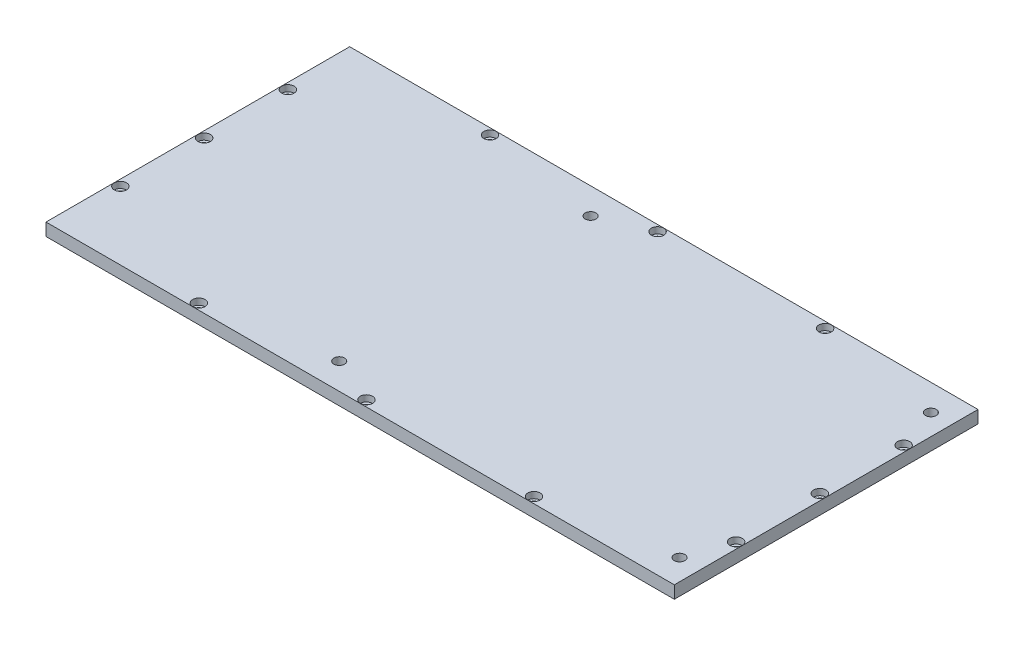
ISO-10303-21;
HEADER;
FILE_DESCRIPTION(('STEP AP214'),'2;1');
FILE_NAME('part.step','',(''),(''),'','','');
FILE_SCHEMA(('AUTOMOTIVE_DESIGN { 1 0 10303 214 1 1 1 1 }'));
ENDSEC;
DATA;
#1=APPLICATION_CONTEXT('core data for automotive mechanical design processes');
#2=APPLICATION_PROTOCOL_DEFINITION('international standard','automotive_design',2000,#1);
#3=PRODUCT_CONTEXT('',#1,'mechanical');
#4=PRODUCT('Part','Part','',(#3));
#5=PRODUCT_RELATED_PRODUCT_CATEGORY('part','',(#4));
#6=PRODUCT_DEFINITION_FORMATION('','',#4);
#7=PRODUCT_DEFINITION_CONTEXT('part definition',#1,'design');
#8=PRODUCT_DEFINITION('design','',#6,#7);
#9=PRODUCT_DEFINITION_SHAPE('','',#8);
#10=(LENGTH_UNIT() NAMED_UNIT(*) SI_UNIT(.MILLI.,.METRE.));
#11=(NAMED_UNIT(*) PLANE_ANGLE_UNIT() SI_UNIT($,.RADIAN.));
#12=(NAMED_UNIT(*) SI_UNIT($,.STERADIAN.) SOLID_ANGLE_UNIT());
#13=UNCERTAINTY_MEASURE_WITH_UNIT(LENGTH_MEASURE(1.E-05),#10,'distance_accuracy_value','');
#14=(GEOMETRIC_REPRESENTATION_CONTEXT(3) GLOBAL_UNCERTAINTY_ASSIGNED_CONTEXT((#13)) GLOBAL_UNIT_ASSIGNED_CONTEXT((#10,
#11,#12)) REPRESENTATION_CONTEXT('',''));
#15=CARTESIAN_POINT('',(0.,0.,0.));
#16=DIRECTION('',(0.,0.,1.));
#17=DIRECTION('',(1.,0.,0.));
#18=AXIS2_PLACEMENT_3D('',#15,#16,#17);
#19=CARTESIAN_POINT('',(147.,6.,0.));
#20=DIRECTION('',(0.,-1.,0.));
#21=DIRECTION('',(0.,0.,-1.));
#22=AXIS2_PLACEMENT_3D('',#19,#20,#21);
#23=CYLINDRICAL_SURFACE('',#22,1.59999999999999);
#24=CARTESIAN_POINT('',(147.,0.,0.));
#25=DIRECTION('',(0.,-1.,0.));
#26=DIRECTION('',(0.,0.,-1.));
#27=AXIS2_PLACEMENT_3D('',#24,#25,#26);
#28=CIRCLE('',#27,1.59999999999999);
#29=CARTESIAN_POINT('',(147.,0.,-1.59999999999999));
#30=VERTEX_POINT('',#29);
#31=EDGE_CURVE('E80',#30,#30,#28,.T.);
#32=ORIENTED_EDGE('',*,*,#31,.T.);
#33=EDGE_LOOP('',(#32));
#34=FACE_BOUND('',#33,.T.);
#35=CARTESIAN_POINT('',(147.,3.,0.));
#36=DIRECTION('',(0.,1.,0.));
#37=DIRECTION('',(0.,0.,1.));
#38=AXIS2_PLACEMENT_3D('',#35,#36,#37);
#39=CIRCLE('',#38,1.59999999999999);
#40=CARTESIAN_POINT('',(147.,3.,1.59999999999999));
#41=VERTEX_POINT('',#40);
#42=EDGE_CURVE('E37',#41,#41,#39,.F.);
#43=ORIENTED_EDGE('',*,*,#42,.F.);
#44=EDGE_LOOP('',(#43));
#45=FACE_BOUND('',#44,.T.);
#46=ADVANCED_FACE('F33',(#34,#45),#23,.F.);
#47=CARTESIAN_POINT('',(-147.,6.,40.));
#48=DIRECTION('',(0.,-1.,0.));
#49=DIRECTION('',(0.,0.,-1.));
#50=AXIS2_PLACEMENT_3D('',#47,#48,#49);
#51=CYLINDRICAL_SURFACE('',#50,1.59999999999999);
#52=CARTESIAN_POINT('',(-147.,0.,40.));
#53=DIRECTION('',(0.,-1.,0.));
#54=DIRECTION('',(0.,0.,1.));
#55=AXIS2_PLACEMENT_3D('',#52,#53,#54);
#56=CIRCLE('',#55,1.59999999999999);
#57=CARTESIAN_POINT('',(-147.,0.,41.6));
#58=VERTEX_POINT('',#57);
#59=EDGE_CURVE('E680',#58,#58,#56,.T.);
#60=ORIENTED_EDGE('',*,*,#59,.T.);
#61=EDGE_LOOP('',(#60));
#62=FACE_BOUND('',#61,.T.);
#63=CARTESIAN_POINT('',(-147.,3.,40.));
#64=DIRECTION('',(0.,1.,0.));
#65=DIRECTION('',(0.,0.,1.));
#66=AXIS2_PLACEMENT_3D('',#63,#64,#65);
#67=CIRCLE('',#66,1.59999999999999);
#68=CARTESIAN_POINT('',(-147.,3.,41.6));
#69=VERTEX_POINT('',#68);
#70=EDGE_CURVE('E127',#69,#69,#67,.F.);
#71=ORIENTED_EDGE('',*,*,#70,.F.);
#72=EDGE_LOOP('',(#71));
#73=FACE_BOUND('',#72,.T.);
#74=ADVANCED_FACE('F196',(#62,#73),#51,.F.);
#75=CARTESIAN_POINT('',(0.,6.,69.5));
#76=DIRECTION('',(0.,-1.,0.));
#77=DIRECTION('',(0.,0.,-1.));
#78=AXIS2_PLACEMENT_3D('',#75,#76,#77);
#79=CYLINDRICAL_SURFACE('',#78,1.6);
#80=CARTESIAN_POINT('',(0.,0.,69.5));
#81=DIRECTION('',(0.,-1.,0.));
#82=DIRECTION('',(0.,0.,-1.));
#83=AXIS2_PLACEMENT_3D('',#80,#81,#82);
#84=CIRCLE('',#83,1.6);
#85=CARTESIAN_POINT('',(0.,0.,67.9));
#86=VERTEX_POINT('',#85);
#87=EDGE_CURVE('E676',#86,#86,#84,.T.);
#88=ORIENTED_EDGE('',*,*,#87,.T.);
#89=EDGE_LOOP('',(#88));
#90=FACE_BOUND('',#89,.T.);
#91=CARTESIAN_POINT('',(0.,3.,69.5));
#92=DIRECTION('',(0.,1.,0.));
#93=DIRECTION('',(0.,0.,1.));
#94=AXIS2_PLACEMENT_3D('',#91,#92,#93);
#95=CIRCLE('',#94,1.6);
#96=CARTESIAN_POINT('',(0.,3.,71.1));
#97=VERTEX_POINT('',#96);
#98=EDGE_CURVE('E125',#97,#97,#95,.F.);
#99=ORIENTED_EDGE('',*,*,#98,.F.);
#100=EDGE_LOOP('',(#99));
#101=FACE_BOUND('',#100,.T.);
#102=ADVANCED_FACE('F202',(#90,#101),#79,.F.);
#103=CARTESIAN_POINT('',(-80.,6.,69.5));
#104=DIRECTION('',(0.,-1.,0.));
#105=DIRECTION('',(0.,0.,-1.));
#106=AXIS2_PLACEMENT_3D('',#103,#104,#105);
#107=CYLINDRICAL_SURFACE('',#106,1.60000000000001);
#108=CARTESIAN_POINT('',(-80.,0.,69.5));
#109=DIRECTION('',(0.,-1.,0.));
#110=DIRECTION('',(0.,0.,-1.));
#111=AXIS2_PLACEMENT_3D('',#108,#109,#110);
#112=CIRCLE('',#111,1.60000000000001);
#113=CARTESIAN_POINT('',(-80.,0.,67.9));
#114=VERTEX_POINT('',#113);
#115=EDGE_CURVE('E672',#114,#114,#112,.T.);
#116=ORIENTED_EDGE('',*,*,#115,.T.);
#117=EDGE_LOOP('',(#116));
#118=FACE_BOUND('',#117,.T.);
#119=CARTESIAN_POINT('',(-80.,3.,69.5));
#120=DIRECTION('',(0.,1.,0.));
#121=DIRECTION('',(0.,0.,1.));
#122=AXIS2_PLACEMENT_3D('',#119,#120,#121);
#123=CIRCLE('',#122,1.60000000000001);
#124=CARTESIAN_POINT('',(-80.,3.,71.1));
#125=VERTEX_POINT('',#124);
#126=EDGE_CURVE('E122',#125,#125,#123,.F.);
#127=ORIENTED_EDGE('',*,*,#126,.F.);
#128=EDGE_LOOP('',(#127));
#129=FACE_BOUND('',#128,.T.);
#130=ADVANCED_FACE('F519',(#118,#129),#107,.F.);
#131=CARTESIAN_POINT('',(80.,6.,69.5));
#132=DIRECTION('',(0.,-1.,0.));
#133=DIRECTION('',(0.,0.,-1.));
#134=AXIS2_PLACEMENT_3D('',#131,#132,#133);
#135=CYLINDRICAL_SURFACE('',#134,1.60000000000001);
#136=CARTESIAN_POINT('',(80.,0.,69.5));
#137=DIRECTION('',(0.,-1.,0.));
#138=DIRECTION('',(0.,0.,1.));
#139=AXIS2_PLACEMENT_3D('',#136,#137,#138);
#140=CIRCLE('',#139,1.60000000000001);
#141=CARTESIAN_POINT('',(80.,0.,71.1));
#142=VERTEX_POINT('',#141);
#143=EDGE_CURVE('E668',#142,#142,#140,.T.);
#144=ORIENTED_EDGE('',*,*,#143,.T.);
#145=EDGE_LOOP('',(#144));
#146=FACE_BOUND('',#145,.T.);
#147=CARTESIAN_POINT('',(80.,3.,69.5));
#148=DIRECTION('',(0.,1.,0.));
#149=DIRECTION('',(0.,0.,1.));
#150=AXIS2_PLACEMENT_3D('',#147,#148,#149);
#151=CIRCLE('',#150,1.60000000000001);
#152=CARTESIAN_POINT('',(80.,3.,71.1));
#153=VERTEX_POINT('',#152);
#154=EDGE_CURVE('E119',#153,#153,#151,.F.);
#155=ORIENTED_EDGE('',*,*,#154,.F.);
#156=EDGE_LOOP('',(#155));
#157=FACE_BOUND('',#156,.T.);
#158=ADVANCED_FACE('F528',(#146,#157),#135,.F.);
#159=CARTESIAN_POINT('',(-147.,6.,0.));
#160=DIRECTION('',(0.,-1.,0.));
#161=DIRECTION('',(0.,0.,-1.));
#162=AXIS2_PLACEMENT_3D('',#159,#160,#161);
#163=CYLINDRICAL_SURFACE('',#162,1.60000000000002);
#164=CARTESIAN_POINT('',(-147.,0.,0.));
#165=DIRECTION('',(0.,-1.,0.));
#166=DIRECTION('',(0.,0.,1.));
#167=AXIS2_PLACEMENT_3D('',#164,#165,#166);
#168=CIRCLE('',#167,1.60000000000002);
#169=CARTESIAN_POINT('',(-147.,0.,1.60000000000002));
#170=VERTEX_POINT('',#169);
#171=EDGE_CURVE('E664',#170,#170,#168,.T.);
#172=ORIENTED_EDGE('',*,*,#171,.T.);
#173=EDGE_LOOP('',(#172));
#174=FACE_BOUND('',#173,.T.);
#175=CARTESIAN_POINT('',(-147.,3.,0.));
#176=DIRECTION('',(0.,1.,0.));
#177=DIRECTION('',(0.,0.,1.));
#178=AXIS2_PLACEMENT_3D('',#175,#176,#177);
#179=CIRCLE('',#178,1.60000000000002);
#180=CARTESIAN_POINT('',(-147.,3.,1.60000000000002));
#181=VERTEX_POINT('',#180);
#182=EDGE_CURVE('E116',#181,#181,#179,.F.);
#183=ORIENTED_EDGE('',*,*,#182,.F.);
#184=EDGE_LOOP('',(#183));
#185=FACE_BOUND('',#184,.T.);
#186=ADVANCED_FACE('F537',(#174,#185),#163,.F.);
#187=CARTESIAN_POINT('',(-147.,6.,-40.));
#188=DIRECTION('',(0.,-1.,0.));
#189=DIRECTION('',(0.,0.,-1.));
#190=AXIS2_PLACEMENT_3D('',#187,#188,#189);
#191=CYLINDRICAL_SURFACE('',#190,1.59999999999999);
#192=CARTESIAN_POINT('',(-147.,0.,-40.));
#193=DIRECTION('',(0.,-1.,0.));
#194=DIRECTION('',(0.,0.,-1.));
#195=AXIS2_PLACEMENT_3D('',#192,#193,#194);
#196=CIRCLE('',#195,1.59999999999999);
#197=CARTESIAN_POINT('',(-147.,0.,-41.6));
#198=VERTEX_POINT('',#197);
#199=EDGE_CURVE('E660',#198,#198,#196,.T.);
#200=ORIENTED_EDGE('',*,*,#199,.T.);
#201=EDGE_LOOP('',(#200));
#202=FACE_BOUND('',#201,.T.);
#203=CARTESIAN_POINT('',(-147.,3.,-40.));
#204=DIRECTION('',(0.,1.,0.));
#205=DIRECTION('',(0.,0.,1.));
#206=AXIS2_PLACEMENT_3D('',#203,#204,#205);
#207=CIRCLE('',#206,1.59999999999999);
#208=CARTESIAN_POINT('',(-147.,3.,-38.4));
#209=VERTEX_POINT('',#208);
#210=EDGE_CURVE('E113',#209,#209,#207,.F.);
#211=ORIENTED_EDGE('',*,*,#210,.F.);
#212=EDGE_LOOP('',(#211));
#213=FACE_BOUND('',#212,.T.);
#214=ADVANCED_FACE('F546',(#202,#213),#191,.F.);
#215=CARTESIAN_POINT('',(147.,6.,-40.));
#216=DIRECTION('',(0.,-1.,0.));
#217=DIRECTION('',(0.,0.,-1.));
#218=AXIS2_PLACEMENT_3D('',#215,#216,#217);
#219=CYLINDRICAL_SURFACE('',#218,1.59999999999999);
#220=CARTESIAN_POINT('',(147.,0.,-40.));
#221=DIRECTION('',(0.,-1.,0.));
#222=DIRECTION('',(0.,0.,1.));
#223=AXIS2_PLACEMENT_3D('',#220,#221,#222);
#224=CIRCLE('',#223,1.59999999999999);
#225=CARTESIAN_POINT('',(147.,0.,-38.4));
#226=VERTEX_POINT('',#225);
#227=EDGE_CURVE('E656',#226,#226,#224,.T.);
#228=ORIENTED_EDGE('',*,*,#227,.T.);
#229=EDGE_LOOP('',(#228));
#230=FACE_BOUND('',#229,.T.);
#231=CARTESIAN_POINT('',(147.,3.,-40.));
#232=DIRECTION('',(0.,1.,0.));
#233=DIRECTION('',(0.,0.,1.));
#234=AXIS2_PLACEMENT_3D('',#231,#232,#233);
#235=CIRCLE('',#234,1.59999999999999);
#236=CARTESIAN_POINT('',(147.,3.,-38.4));
#237=VERTEX_POINT('',#236);
#238=EDGE_CURVE('E110',#237,#237,#235,.F.);
#239=ORIENTED_EDGE('',*,*,#238,.F.);
#240=EDGE_LOOP('',(#239));
#241=FACE_BOUND('',#240,.T.);
#242=ADVANCED_FACE('F555',(#230,#241),#219,.F.);
#243=CARTESIAN_POINT('',(147.,6.,40.));
#244=DIRECTION('',(0.,-1.,0.));
#245=DIRECTION('',(0.,0.,-1.));
#246=AXIS2_PLACEMENT_3D('',#243,#244,#245);
#247=CYLINDRICAL_SURFACE('',#246,1.59999999999999);
#248=CARTESIAN_POINT('',(147.,0.,40.));
#249=DIRECTION('',(0.,-1.,0.));
#250=DIRECTION('',(0.,0.,-1.));
#251=AXIS2_PLACEMENT_3D('',#248,#249,#250);
#252=CIRCLE('',#251,1.59999999999999);
#253=CARTESIAN_POINT('',(147.,0.,38.4));
#254=VERTEX_POINT('',#253);
#255=EDGE_CURVE('E146',#254,#254,#252,.T.);
#256=ORIENTED_EDGE('',*,*,#255,.T.);
#257=EDGE_LOOP('',(#256));
#258=FACE_BOUND('',#257,.T.);
#259=CARTESIAN_POINT('',(147.,3.,40.));
#260=DIRECTION('',(0.,1.,0.));
#261=DIRECTION('',(0.,0.,1.));
#262=AXIS2_PLACEMENT_3D('',#259,#260,#261);
#263=CIRCLE('',#262,1.59999999999999);
#264=CARTESIAN_POINT('',(147.,3.,41.6));
#265=VERTEX_POINT('',#264);
#266=EDGE_CURVE('E107',#265,#265,#263,.F.);
#267=ORIENTED_EDGE('',*,*,#266,.F.);
#268=EDGE_LOOP('',(#267));
#269=FACE_BOUND('',#268,.T.);
#270=ADVANCED_FACE('F564',(#258,#269),#247,.F.);
#271=CARTESIAN_POINT('',(80.,6.,-69.5));
#272=DIRECTION('',(0.,-1.,0.));
#273=DIRECTION('',(0.,0.,-1.));
#274=AXIS2_PLACEMENT_3D('',#271,#272,#273);
#275=CYLINDRICAL_SURFACE('',#274,1.60000000000001);
#276=CARTESIAN_POINT('',(80.,0.,-69.5));
#277=DIRECTION('',(0.,-1.,0.));
#278=DIRECTION('',(0.,0.,-1.));
#279=AXIS2_PLACEMENT_3D('',#276,#277,#278);
#280=CIRCLE('',#279,1.60000000000001);
#281=CARTESIAN_POINT('',(80.,0.,-71.1));
#282=VERTEX_POINT('',#281);
#283=EDGE_CURVE('E141',#282,#282,#280,.T.);
#284=ORIENTED_EDGE('',*,*,#283,.T.);
#285=EDGE_LOOP('',(#284));
#286=FACE_BOUND('',#285,.T.);
#287=CARTESIAN_POINT('',(80.,3.,-69.5));
#288=DIRECTION('',(0.,1.,0.));
#289=DIRECTION('',(0.,0.,1.));
#290=AXIS2_PLACEMENT_3D('',#287,#288,#289);
#291=CIRCLE('',#290,1.60000000000001);
#292=CARTESIAN_POINT('',(80.,3.,-67.9));
#293=VERTEX_POINT('',#292);
#294=EDGE_CURVE('E104',#293,#293,#291,.F.);
#295=ORIENTED_EDGE('',*,*,#294,.F.);
#296=EDGE_LOOP('',(#295));
#297=FACE_BOUND('',#296,.T.);
#298=ADVANCED_FACE('F573',(#286,#297),#275,.F.);
#299=CARTESIAN_POINT('',(0.,6.,-69.5));
#300=DIRECTION('',(0.,-1.,0.));
#301=DIRECTION('',(0.,0.,-1.));
#302=AXIS2_PLACEMENT_3D('',#299,#300,#301);
#303=CYLINDRICAL_SURFACE('',#302,1.6);
#304=CARTESIAN_POINT('',(0.,0.,-69.5));
#305=DIRECTION('',(0.,-1.,0.));
#306=DIRECTION('',(0.,0.,1.));
#307=AXIS2_PLACEMENT_3D('',#304,#305,#306);
#308=CIRCLE('',#307,1.6);
#309=CARTESIAN_POINT('',(0.,0.,-67.9));
#310=VERTEX_POINT('',#309);
#311=EDGE_CURVE('E136',#310,#310,#308,.T.);
#312=ORIENTED_EDGE('',*,*,#311,.T.);
#313=EDGE_LOOP('',(#312));
#314=FACE_BOUND('',#313,.T.);
#315=CARTESIAN_POINT('',(0.,3.,-69.5));
#316=DIRECTION('',(0.,1.,0.));
#317=DIRECTION('',(0.,0.,1.));
#318=AXIS2_PLACEMENT_3D('',#315,#316,#317);
#319=CIRCLE('',#318,1.6);
#320=CARTESIAN_POINT('',(0.,3.,-67.9));
#321=VERTEX_POINT('',#320);
#322=EDGE_CURVE('E100',#321,#321,#319,.F.);
#323=ORIENTED_EDGE('',*,*,#322,.F.);
#324=EDGE_LOOP('',(#323));
#325=FACE_BOUND('',#324,.T.);
#326=ADVANCED_FACE('F582',(#314,#325),#303,.F.);
#327=CARTESIAN_POINT('',(-80.,6.,-69.5));
#328=DIRECTION('',(0.,-1.,0.));
#329=DIRECTION('',(0.,0.,-1.));
#330=AXIS2_PLACEMENT_3D('',#327,#328,#329);
#331=CYLINDRICAL_SURFACE('',#330,1.60000000000001);
#332=CARTESIAN_POINT('',(-80.,0.,-69.5));
#333=DIRECTION('',(0.,-1.,0.));
#334=DIRECTION('',(0.,0.,1.));
#335=AXIS2_PLACEMENT_3D('',#332,#333,#334);
#336=CIRCLE('',#335,1.60000000000001);
#337=CARTESIAN_POINT('',(-80.,0.,-67.9));
#338=VERTEX_POINT('',#337);
#339=EDGE_CURVE('E132',#338,#338,#336,.T.);
#340=ORIENTED_EDGE('',*,*,#339,.T.);
#341=EDGE_LOOP('',(#340));
#342=FACE_BOUND('',#341,.T.);
#343=CARTESIAN_POINT('',(-80.,3.,-69.5));
#344=DIRECTION('',(0.,1.,0.));
#345=DIRECTION('',(0.,0.,1.));
#346=AXIS2_PLACEMENT_3D('',#343,#344,#345);
#347=CIRCLE('',#346,1.60000000000001);
#348=CARTESIAN_POINT('',(-80.,3.,-67.9));
#349=VERTEX_POINT('',#348);
#350=EDGE_CURVE('E97',#349,#349,#347,.F.);
#351=ORIENTED_EDGE('',*,*,#350,.F.);
#352=EDGE_LOOP('',(#351));
#353=FACE_BOUND('',#352,.T.);
#354=ADVANCED_FACE('F194',(#342,#353),#331,.F.);
#355=CARTESIAN_POINT('',(150.,60.,-72.5));
#356=DIRECTION('',(-1.,0.,0.));
#357=DIRECTION('',(0.,0.,1.));
#358=AXIS2_PLACEMENT_3D('',#355,#356,#357);
#359=PLANE('',#358);
#360=DIRECTION('',(0.,0.,-1.));
#361=VECTOR('',#360,1.);
#362=CARTESIAN_POINT('',(150.,6.,72.5));
#363=LINE('',#362,#361);
#364=CARTESIAN_POINT('',(150.,6.,72.5));
#365=VERTEX_POINT('',#364);
#366=CARTESIAN_POINT('',(150.,6.,-72.5));
#367=VERTEX_POINT('',#366);
#368=EDGE_CURVE('E76',#365,#367,#363,.T.);
#369=ORIENTED_EDGE('',*,*,#368,.F.);
#370=DIRECTION('',(0.,-1.,0.));
#371=VECTOR('',#370,1.);
#372=CARTESIAN_POINT('',(150.,60.,72.5));
#373=LINE('',#372,#371);
#374=CARTESIAN_POINT('',(150.,0.,72.5));
#375=VERTEX_POINT('',#374);
#376=EDGE_CURVE('E58',#365,#375,#373,.T.);
#377=ORIENTED_EDGE('',*,*,#376,.T.);
#378=DIRECTION('',(0.,0.,-1.));
#379=VECTOR('',#378,1.);
#380=CARTESIAN_POINT('',(150.,0.,-72.5));
#381=LINE('',#380,#379);
#382=CARTESIAN_POINT('',(150.,0.,-72.5));
#383=VERTEX_POINT('',#382);
#384=EDGE_CURVE('E172',#375,#383,#381,.T.);
#385=ORIENTED_EDGE('',*,*,#384,.T.);
#386=DIRECTION('',(0.,-1.,0.));
#387=VECTOR('',#386,1.);
#388=CARTESIAN_POINT('',(150.,60.,-72.5));
#389=LINE('',#388,#387);
#390=EDGE_CURVE('E11',#367,#383,#389,.T.);
#391=ORIENTED_EDGE('',*,*,#390,.F.);
#392=EDGE_LOOP('',(#369,#377,#385,#391));
#393=FACE_BOUND('',#392,.T.);
#394=ADVANCED_FACE('F35',(#393),#359,.F.);
#395=CARTESIAN_POINT('',(-150.,60.,-72.5));
#396=DIRECTION('',(0.,0.,1.));
#397=DIRECTION('',(1.,0.,0.));
#398=AXIS2_PLACEMENT_3D('',#395,#396,#397);
#399=PLANE('',#398);
#400=DIRECTION('',(-1.,0.,0.));
#401=VECTOR('',#400,1.);
#402=CARTESIAN_POINT('',(150.,6.,-72.5));
#403=LINE('',#402,#401);
#404=CARTESIAN_POINT('',(-150.,6.,-72.5));
#405=VERTEX_POINT('',#404);
#406=EDGE_CURVE('E83',#367,#405,#403,.T.);
#407=ORIENTED_EDGE('',*,*,#406,.F.);
#408=ORIENTED_EDGE('',*,*,#390,.T.);
#409=DIRECTION('',(-1.,0.,0.));
#410=VECTOR('',#409,1.);
#411=CARTESIAN_POINT('',(-150.,0.,-72.5));
#412=LINE('',#411,#410);
#413=CARTESIAN_POINT('',(-150.,0.,-72.5));
#414=VERTEX_POINT('',#413);
#415=EDGE_CURVE('E176',#383,#414,#412,.T.);
#416=ORIENTED_EDGE('',*,*,#415,.T.);
#417=DIRECTION('',(0.,-1.,0.));
#418=VECTOR('',#417,1.);
#419=CARTESIAN_POINT('',(-150.,60.,-72.5));
#420=LINE('',#419,#418);
#421=EDGE_CURVE('E42',#405,#414,#420,.T.);
#422=ORIENTED_EDGE('',*,*,#421,.F.);
#423=EDGE_LOOP('',(#407,#408,#416,#422));
#424=FACE_BOUND('',#423,.T.);
#425=ADVANCED_FACE('F187',(#424),#399,.F.);
#426=CARTESIAN_POINT('',(-150.,60.,-72.5));
#427=DIRECTION('',(1.,0.,0.));
#428=DIRECTION('',(0.,0.,-1.));
#429=AXIS2_PLACEMENT_3D('',#426,#427,#428);
#430=PLANE('',#429);
#431=DIRECTION('',(0.,0.,1.));
#432=VECTOR('',#431,1.);
#433=CARTESIAN_POINT('',(-150.,6.,-72.5));
#434=LINE('',#433,#432);
#435=CARTESIAN_POINT('',(-150.,6.,72.5));
#436=VERTEX_POINT('',#435);
#437=EDGE_CURVE('E50',#405,#436,#434,.T.);
#438=ORIENTED_EDGE('',*,*,#437,.F.);
#439=ORIENTED_EDGE('',*,*,#421,.T.);
#440=DIRECTION('',(0.,0.,1.));
#441=VECTOR('',#440,1.);
#442=CARTESIAN_POINT('',(-150.,0.,-72.5));
#443=LINE('',#442,#441);
#444=CARTESIAN_POINT('',(-150.,0.,72.5));
#445=VERTEX_POINT('',#444);
#446=EDGE_CURVE('E92',#414,#445,#443,.T.);
#447=ORIENTED_EDGE('',*,*,#446,.T.);
#448=DIRECTION('',(0.,-1.,0.));
#449=VECTOR('',#448,1.);
#450=CARTESIAN_POINT('',(-150.,60.,72.5));
#451=LINE('',#450,#449);
#452=EDGE_CURVE('E89',#436,#445,#451,.T.);
#453=ORIENTED_EDGE('',*,*,#452,.F.);
#454=EDGE_LOOP('',(#438,#439,#447,#453));
#455=FACE_BOUND('',#454,.T.);
#456=ADVANCED_FACE('F181',(#455),#430,.F.);
#457=CARTESIAN_POINT('',(-150.,60.,72.5));
#458=DIRECTION('',(0.,0.,-1.));
#459=DIRECTION('',(-1.,0.,0.));
#460=AXIS2_PLACEMENT_3D('',#457,#458,#459);
#461=PLANE('',#460);
#462=DIRECTION('',(1.,0.,0.));
#463=VECTOR('',#462,1.);
#464=CARTESIAN_POINT('',(-150.,6.,72.5));
#465=LINE('',#464,#463);
#466=EDGE_CURVE('E74',#436,#365,#465,.T.);
#467=ORIENTED_EDGE('',*,*,#466,.F.);
#468=ORIENTED_EDGE('',*,*,#452,.T.);
#469=DIRECTION('',(1.,0.,0.));
#470=VECTOR('',#469,1.);
#471=CARTESIAN_POINT('',(-150.,0.,72.5));
#472=LINE('',#471,#470);
#473=EDGE_CURVE('E87',#445,#375,#472,.T.);
#474=ORIENTED_EDGE('',*,*,#473,.T.);
#475=ORIENTED_EDGE('',*,*,#376,.F.);
#476=EDGE_LOOP('',(#467,#468,#474,#475));
#477=FACE_BOUND('',#476,.T.);
#478=ADVANCED_FACE('F85',(#477),#461,.F.);
#479=CARTESIAN_POINT('',(0.,0.,0.));
#480=DIRECTION('',(0.,1.,0.));
#481=DIRECTION('',(0.,0.,1.));
#482=AXIS2_PLACEMENT_3D('',#479,#480,#481);
#483=PLANE('',#482);
#484=ORIENTED_EDGE('',*,*,#339,.F.);
#485=EDGE_LOOP('',(#484));
#486=FACE_BOUND('',#485,.T.);
#487=ORIENTED_EDGE('',*,*,#311,.F.);
#488=EDGE_LOOP('',(#487));
#489=FACE_BOUND('',#488,.T.);
#490=ORIENTED_EDGE('',*,*,#283,.F.);
#491=EDGE_LOOP('',(#490));
#492=FACE_BOUND('',#491,.T.);
#493=ORIENTED_EDGE('',*,*,#255,.F.);
#494=EDGE_LOOP('',(#493));
#495=FACE_BOUND('',#494,.T.);
#496=ORIENTED_EDGE('',*,*,#227,.F.);
#497=EDGE_LOOP('',(#496));
#498=FACE_BOUND('',#497,.T.);
#499=ORIENTED_EDGE('',*,*,#199,.F.);
#500=EDGE_LOOP('',(#499));
#501=FACE_BOUND('',#500,.T.);
#502=ORIENTED_EDGE('',*,*,#171,.F.);
#503=EDGE_LOOP('',(#502));
#504=FACE_BOUND('',#503,.T.);
#505=ORIENTED_EDGE('',*,*,#143,.F.);
#506=EDGE_LOOP('',(#505));
#507=FACE_BOUND('',#506,.T.);
#508=ORIENTED_EDGE('',*,*,#115,.F.);
#509=EDGE_LOOP('',(#508));
#510=FACE_BOUND('',#509,.T.);
#511=ORIENTED_EDGE('',*,*,#87,.F.);
#512=EDGE_LOOP('',(#511));
#513=FACE_BOUND('',#512,.T.);
#514=ORIENTED_EDGE('',*,*,#59,.F.);
#515=EDGE_LOOP('',(#514));
#516=FACE_BOUND('',#515,.T.);
#517=ORIENTED_EDGE('',*,*,#31,.F.);
#518=EDGE_LOOP('',(#517));
#519=FACE_BOUND('',#518,.T.);
#520=CARTESIAN_POINT('',(-22.5000000000001,0.,-60.));
#521=DIRECTION('',(0.,1.,0.));
#522=DIRECTION('',(0.,0.,-1.));
#523=AXIS2_PLACEMENT_3D('',#520,#521,#522);
#524=CIRCLE('',#523,2.54999999999999);
#525=CARTESIAN_POINT('',(-22.5000000000001,0.,-62.55));
#526=VERTEX_POINT('',#525);
#527=EDGE_CURVE('E164',#526,#526,#524,.T.);
#528=ORIENTED_EDGE('',*,*,#527,.T.);
#529=EDGE_LOOP('',(#528));
#530=FACE_BOUND('',#529,.T.);
#531=CARTESIAN_POINT('',(-22.5000000000001,0.,60.));
#532=DIRECTION('',(0.,1.,0.));
#533=DIRECTION('',(0.,0.,1.));
#534=AXIS2_PLACEMENT_3D('',#531,#532,#533);
#535=CIRCLE('',#534,2.54999999999999);
#536=CARTESIAN_POINT('',(-22.5000000000001,0.,62.55));
#537=VERTEX_POINT('',#536);
#538=EDGE_CURVE('E158',#537,#537,#535,.T.);
#539=ORIENTED_EDGE('',*,*,#538,.T.);
#540=EDGE_LOOP('',(#539));
#541=FACE_BOUND('',#540,.T.);
#542=CARTESIAN_POINT('',(140.,0.,60.));
#543=DIRECTION('',(0.,1.,0.));
#544=DIRECTION('',(0.,0.,-1.));
#545=AXIS2_PLACEMENT_3D('',#542,#543,#544);
#546=CIRCLE('',#545,2.54999999999999);
#547=CARTESIAN_POINT('',(140.,0.,57.45));
#548=VERTEX_POINT('',#547);
#549=EDGE_CURVE('E151',#548,#548,#546,.T.);
#550=ORIENTED_EDGE('',*,*,#549,.T.);
#551=EDGE_LOOP('',(#550));
#552=FACE_BOUND('',#551,.T.);
#553=CARTESIAN_POINT('',(140.,0.,-60.));
#554=DIRECTION('',(0.,1.,0.));
#555=DIRECTION('',(0.,0.,1.));
#556=AXIS2_PLACEMENT_3D('',#553,#554,#555);
#557=CIRCLE('',#556,2.54999999999999);
#558=CARTESIAN_POINT('',(140.,0.,-57.45));
#559=VERTEX_POINT('',#558);
#560=EDGE_CURVE('E169',#559,#559,#557,.T.);
#561=ORIENTED_EDGE('',*,*,#560,.T.);
#562=EDGE_LOOP('',(#561));
#563=FACE_BOUND('',#562,.T.);
#564=ORIENTED_EDGE('',*,*,#384,.F.);
#565=ORIENTED_EDGE('',*,*,#473,.F.);
#566=ORIENTED_EDGE('',*,*,#446,.F.);
#567=ORIENTED_EDGE('',*,*,#415,.F.);
#568=EDGE_LOOP('',(#564,#565,#566,#567));
#569=FACE_BOUND('',#568,.T.);
#570=ADVANCED_FACE('F185',(#486,#489,#492,#495,#498,#501,#504,#507,#510,#513,#516,#519,#530,
#541,#552,#563,#569),#483,.F.);
#571=CARTESIAN_POINT('',(0.,6.,0.));
#572=DIRECTION('',(0.,1.,0.));
#573=DIRECTION('',(0.,0.,1.));
#574=AXIS2_PLACEMENT_3D('',#571,#572,#573);
#575=PLANE('',#574);
#576=CARTESIAN_POINT('',(-80.,6.,69.5));
#577=DIRECTION('',(0.,1.,0.));
#578=DIRECTION('',(0.,0.,1.));
#579=AXIS2_PLACEMENT_3D('',#576,#577,#578);
#580=CIRCLE('',#579,2.95);
#581=CARTESIAN_POINT('',(-80.,6.,72.45));
#582=VERTEX_POINT('',#581);
#583=EDGE_CURVE('E717',#582,#582,#580,.T.);
#584=ORIENTED_EDGE('',*,*,#583,.F.);
#585=EDGE_LOOP('',(#584));
#586=FACE_BOUND('',#585,.T.);
#587=CARTESIAN_POINT('',(0.,6.,69.5));
#588=DIRECTION('',(0.,1.,0.));
#589=DIRECTION('',(0.,0.,1.));
#590=AXIS2_PLACEMENT_3D('',#587,#588,#589);
#591=CIRCLE('',#590,2.95);
#592=CARTESIAN_POINT('',(0.,6.,72.45));
#593=VERTEX_POINT('',#592);
#594=EDGE_CURVE('E723',#593,#593,#591,.T.);
#595=ORIENTED_EDGE('',*,*,#594,.F.);
#596=EDGE_LOOP('',(#595));
#597=FACE_BOUND('',#596,.T.);
#598=CARTESIAN_POINT('',(80.,6.,69.5));
#599=DIRECTION('',(0.,1.,0.));
#600=DIRECTION('',(0.,0.,1.));
#601=AXIS2_PLACEMENT_3D('',#598,#599,#600);
#602=CIRCLE('',#601,2.95);
#603=CARTESIAN_POINT('',(80.,6.,72.45));
#604=VERTEX_POINT('',#603);
#605=EDGE_CURVE('E729',#604,#604,#602,.T.);
#606=ORIENTED_EDGE('',*,*,#605,.F.);
#607=EDGE_LOOP('',(#606));
#608=FACE_BOUND('',#607,.T.);
#609=CARTESIAN_POINT('',(-147.,6.,40.));
#610=DIRECTION('',(0.,1.,0.));
#611=DIRECTION('',(0.,0.,1.));
#612=AXIS2_PLACEMENT_3D('',#609,#610,#611);
#613=CIRCLE('',#612,2.95);
#614=CARTESIAN_POINT('',(-147.,6.,42.95));
#615=VERTEX_POINT('',#614);
#616=EDGE_CURVE('E735',#615,#615,#613,.T.);
#617=ORIENTED_EDGE('',*,*,#616,.F.);
#618=EDGE_LOOP('',(#617));
#619=FACE_BOUND('',#618,.T.);
#620=CARTESIAN_POINT('',(-147.,6.,0.));
#621=DIRECTION('',(0.,1.,0.));
#622=DIRECTION('',(0.,0.,1.));
#623=AXIS2_PLACEMENT_3D('',#620,#621,#622);
#624=CIRCLE('',#623,2.95);
#625=CARTESIAN_POINT('',(-147.,6.,2.95));
#626=VERTEX_POINT('',#625);
#627=EDGE_CURVE('E741',#626,#626,#624,.T.);
#628=ORIENTED_EDGE('',*,*,#627,.F.);
#629=EDGE_LOOP('',(#628));
#630=FACE_BOUND('',#629,.T.);
#631=CARTESIAN_POINT('',(-147.,6.,-40.));
#632=DIRECTION('',(0.,1.,0.));
#633=DIRECTION('',(0.,0.,1.));
#634=AXIS2_PLACEMENT_3D('',#631,#632,#633);
#635=CIRCLE('',#634,2.95);
#636=CARTESIAN_POINT('',(-147.,6.,-37.05));
#637=VERTEX_POINT('',#636);
#638=EDGE_CURVE('E747',#637,#637,#635,.T.);
#639=ORIENTED_EDGE('',*,*,#638,.F.);
#640=EDGE_LOOP('',(#639));
#641=FACE_BOUND('',#640,.T.);
#642=CARTESIAN_POINT('',(-80.,6.,-69.5));
#643=DIRECTION('',(0.,1.,0.));
#644=DIRECTION('',(0.,0.,1.));
#645=AXIS2_PLACEMENT_3D('',#642,#643,#644);
#646=CIRCLE('',#645,2.95);
#647=CARTESIAN_POINT('',(-80.,6.,-66.55));
#648=VERTEX_POINT('',#647);
#649=EDGE_CURVE('E753',#648,#648,#646,.T.);
#650=ORIENTED_EDGE('',*,*,#649,.F.);
#651=EDGE_LOOP('',(#650));
#652=FACE_BOUND('',#651,.T.);
#653=CARTESIAN_POINT('',(0.,6.,-69.5));
#654=DIRECTION('',(0.,1.,0.));
#655=DIRECTION('',(0.,0.,1.));
#656=AXIS2_PLACEMENT_3D('',#653,#654,#655);
#657=CIRCLE('',#656,2.95);
#658=CARTESIAN_POINT('',(0.,6.,-66.55));
#659=VERTEX_POINT('',#658);
#660=EDGE_CURVE('E759',#659,#659,#657,.T.);
#661=ORIENTED_EDGE('',*,*,#660,.F.);
#662=EDGE_LOOP('',(#661));
#663=FACE_BOUND('',#662,.T.);
#664=CARTESIAN_POINT('',(80.,6.,-69.5));
#665=DIRECTION('',(0.,1.,0.));
#666=DIRECTION('',(0.,0.,1.));
#667=AXIS2_PLACEMENT_3D('',#664,#665,#666);
#668=CIRCLE('',#667,2.95);
#669=CARTESIAN_POINT('',(80.,6.,-66.55));
#670=VERTEX_POINT('',#669);
#671=EDGE_CURVE('E765',#670,#670,#668,.T.);
#672=ORIENTED_EDGE('',*,*,#671,.F.);
#673=EDGE_LOOP('',(#672));
#674=FACE_BOUND('',#673,.T.);
#675=CARTESIAN_POINT('',(147.,6.,-40.));
#676=DIRECTION('',(0.,1.,0.));
#677=DIRECTION('',(0.,0.,1.));
#678=AXIS2_PLACEMENT_3D('',#675,#676,#677);
#679=CIRCLE('',#678,2.95);
#680=CARTESIAN_POINT('',(147.,6.,-37.05));
#681=VERTEX_POINT('',#680);
#682=EDGE_CURVE('E771',#681,#681,#679,.T.);
#683=ORIENTED_EDGE('',*,*,#682,.F.);
#684=EDGE_LOOP('',(#683));
#685=FACE_BOUND('',#684,.T.);
#686=CARTESIAN_POINT('',(147.,6.,0.));
#687=DIRECTION('',(0.,1.,0.));
#688=DIRECTION('',(0.,0.,1.));
#689=AXIS2_PLACEMENT_3D('',#686,#687,#688);
#690=CIRCLE('',#689,2.95);
#691=CARTESIAN_POINT('',(147.,6.,2.95));
#692=VERTEX_POINT('',#691);
#693=EDGE_CURVE('E777',#692,#692,#690,.T.);
#694=ORIENTED_EDGE('',*,*,#693,.F.);
#695=EDGE_LOOP('',(#694));
#696=FACE_BOUND('',#695,.T.);
#697=CARTESIAN_POINT('',(147.,6.,40.));
#698=DIRECTION('',(0.,1.,0.));
#699=DIRECTION('',(0.,0.,1.));
#700=AXIS2_PLACEMENT_3D('',#697,#698,#699);
#701=CIRCLE('',#700,2.95);
#702=CARTESIAN_POINT('',(147.,6.,42.95));
#703=VERTEX_POINT('',#702);
#704=EDGE_CURVE('E711',#703,#703,#701,.T.);
#705=ORIENTED_EDGE('',*,*,#704,.F.);
#706=EDGE_LOOP('',(#705));
#707=FACE_BOUND('',#706,.T.);
#708=CARTESIAN_POINT('',(-22.5000000000001,6.,-60.));
#709=DIRECTION('',(0.,1.,0.));
#710=DIRECTION('',(0.,0.,-1.));
#711=AXIS2_PLACEMENT_3D('',#708,#709,#710);
#712=CIRCLE('',#711,2.54999999999999);
#713=CARTESIAN_POINT('',(-22.5000000000001,6.,-62.55));
#714=VERTEX_POINT('',#713);
#715=EDGE_CURVE('E150',#714,#714,#712,.T.);
#716=ORIENTED_EDGE('',*,*,#715,.F.);
#717=EDGE_LOOP('',(#716));
#718=FACE_BOUND('',#717,.T.);
#719=CARTESIAN_POINT('',(-22.5000000000001,6.,60.));
#720=DIRECTION('',(0.,1.,0.));
#721=DIRECTION('',(0.,0.,1.));
#722=AXIS2_PLACEMENT_3D('',#719,#720,#721);
#723=CIRCLE('',#722,2.54999999999999);
#724=CARTESIAN_POINT('',(-22.5000000000001,6.,62.55));
#725=VERTEX_POINT('',#724);
#726=EDGE_CURVE('E161',#725,#725,#723,.T.);
#727=ORIENTED_EDGE('',*,*,#726,.F.);
#728=EDGE_LOOP('',(#727));
#729=FACE_BOUND('',#728,.T.);
#730=CARTESIAN_POINT('',(140.,6.,60.));
#731=DIRECTION('',(0.,1.,0.));
#732=DIRECTION('',(0.,0.,-1.));
#733=AXIS2_PLACEMENT_3D('',#730,#731,#732);
#734=CIRCLE('',#733,2.54999999999999);
#735=CARTESIAN_POINT('',(140.,6.,57.45));
#736=VERTEX_POINT('',#735);
#737=EDGE_CURVE('E155',#736,#736,#734,.T.);
#738=ORIENTED_EDGE('',*,*,#737,.F.);
#739=EDGE_LOOP('',(#738));
#740=FACE_BOUND('',#739,.T.);
#741=CARTESIAN_POINT('',(140.,6.,-60.));
#742=DIRECTION('',(0.,1.,0.));
#743=DIRECTION('',(0.,0.,1.));
#744=AXIS2_PLACEMENT_3D('',#741,#742,#743);
#745=CIRCLE('',#744,2.54999999999999);
#746=CARTESIAN_POINT('',(140.,6.,-57.45));
#747=VERTEX_POINT('',#746);
#748=EDGE_CURVE('E154',#747,#747,#745,.T.);
#749=ORIENTED_EDGE('',*,*,#748,.F.);
#750=EDGE_LOOP('',(#749));
#751=FACE_BOUND('',#750,.T.);
#752=ORIENTED_EDGE('',*,*,#466,.T.);
#753=ORIENTED_EDGE('',*,*,#368,.T.);
#754=ORIENTED_EDGE('',*,*,#406,.T.);
#755=ORIENTED_EDGE('',*,*,#437,.T.);
#756=EDGE_LOOP('',(#752,#753,#754,#755));
#757=FACE_BOUND('',#756,.T.);
#758=ADVANCED_FACE('F75',(#586,#597,#608,#619,#630,#641,#652,#663,#674,#685,#696,#707,#718,#729,
#740,#751,#757),#575,.T.);
#759=CARTESIAN_POINT('',(140.,0.,-60.));
#760=DIRECTION('',(0.,1.,0.));
#761=DIRECTION('',(0.,0.,1.));
#762=AXIS2_PLACEMENT_3D('',#759,#760,#761);
#763=CYLINDRICAL_SURFACE('',#762,2.54999999999999);
#764=ORIENTED_EDGE('',*,*,#560,.F.);
#765=EDGE_LOOP('',(#764));
#766=FACE_BOUND('',#765,.T.);
#767=ORIENTED_EDGE('',*,*,#748,.T.);
#768=EDGE_LOOP('',(#767));
#769=FACE_BOUND('',#768,.T.);
#770=ADVANCED_FACE('F213',(#766,#769),#763,.F.);
#771=CARTESIAN_POINT('',(140.,0.,60.));
#772=DIRECTION('',(0.,1.,0.));
#773=DIRECTION('',(0.,0.,1.));
#774=AXIS2_PLACEMENT_3D('',#771,#772,#773);
#775=CYLINDRICAL_SURFACE('',#774,2.54999999999999);
#776=ORIENTED_EDGE('',*,*,#549,.F.);
#777=EDGE_LOOP('',(#776));
#778=FACE_BOUND('',#777,.T.);
#779=ORIENTED_EDGE('',*,*,#737,.T.);
#780=EDGE_LOOP('',(#779));
#781=FACE_BOUND('',#780,.T.);
#782=ADVANCED_FACE('F209',(#778,#781),#775,.F.);
#783=CARTESIAN_POINT('',(-22.5000000000001,0.,60.));
#784=DIRECTION('',(0.,1.,0.));
#785=DIRECTION('',(0.,0.,1.));
#786=AXIS2_PLACEMENT_3D('',#783,#784,#785);
#787=CYLINDRICAL_SURFACE('',#786,2.54999999999999);
#788=ORIENTED_EDGE('',*,*,#538,.F.);
#789=EDGE_LOOP('',(#788));
#790=FACE_BOUND('',#789,.T.);
#791=ORIENTED_EDGE('',*,*,#726,.T.);
#792=EDGE_LOOP('',(#791));
#793=FACE_BOUND('',#792,.T.);
#794=ADVANCED_FACE('F212',(#790,#793),#787,.F.);
#795=CARTESIAN_POINT('',(-22.5000000000001,0.,-60.));
#796=DIRECTION('',(0.,1.,0.));
#797=DIRECTION('',(0.,0.,1.));
#798=AXIS2_PLACEMENT_3D('',#795,#796,#797);
#799=CYLINDRICAL_SURFACE('',#798,2.54999999999999);
#800=ORIENTED_EDGE('',*,*,#527,.F.);
#801=EDGE_LOOP('',(#800));
#802=FACE_BOUND('',#801,.T.);
#803=ORIENTED_EDGE('',*,*,#715,.T.);
#804=EDGE_LOOP('',(#803));
#805=FACE_BOUND('',#804,.T.);
#806=ADVANCED_FACE('F217',(#802,#805),#799,.F.);
#807=CARTESIAN_POINT('',(-80.,3.,-69.5));
#808=DIRECTION('',(0.,1.,0.));
#809=DIRECTION('',(0.,0.,1.));
#810=AXIS2_PLACEMENT_3D('',#807,#808,#809);
#811=PLANE('',#810);
#812=CARTESIAN_POINT('',(-80.,3.,-69.5));
#813=DIRECTION('',(0.,1.,0.));
#814=DIRECTION('',(0.,0.,1.));
#815=AXIS2_PLACEMENT_3D('',#812,#813,#814);
#816=CIRCLE('',#815,2.95);
#817=CARTESIAN_POINT('',(-80.,3.,-66.55));
#818=VERTEX_POINT('',#817);
#819=EDGE_CURVE('E756',#818,#818,#816,.T.);
#820=ORIENTED_EDGE('',*,*,#819,.T.);
#821=EDGE_LOOP('',(#820));
#822=FACE_BOUND('',#821,.T.);
#823=ORIENTED_EDGE('',*,*,#350,.T.);
#824=EDGE_LOOP('',(#823));
#825=FACE_BOUND('',#824,.T.);
#826=ADVANCED_FACE('F221',(#822,#825),#811,.T.);
#827=CARTESIAN_POINT('',(-80.,3.,-69.5));
#828=DIRECTION('',(0.,1.,0.));
#829=DIRECTION('',(0.,0.,1.));
#830=AXIS2_PLACEMENT_3D('',#827,#828,#829);
#831=CYLINDRICAL_SURFACE('',#830,2.95);
#832=ORIENTED_EDGE('',*,*,#819,.F.);
#833=EDGE_LOOP('',(#832));
#834=FACE_BOUND('',#833,.T.);
#835=ORIENTED_EDGE('',*,*,#649,.T.);
#836=EDGE_LOOP('',(#835));
#837=FACE_BOUND('',#836,.T.);
#838=ADVANCED_FACE('F269',(#834,#837),#831,.F.);
#839=CARTESIAN_POINT('',(0.,3.,-69.5));
#840=DIRECTION('',(0.,1.,0.));
#841=DIRECTION('',(0.,0.,1.));
#842=AXIS2_PLACEMENT_3D('',#839,#840,#841);
#843=PLANE('',#842);
#844=CARTESIAN_POINT('',(0.,3.,-69.5));
#845=DIRECTION('',(0.,1.,0.));
#846=DIRECTION('',(0.,0.,1.));
#847=AXIS2_PLACEMENT_3D('',#844,#845,#846);
#848=CIRCLE('',#847,2.95);
#849=CARTESIAN_POINT('',(0.,3.,-66.55));
#850=VERTEX_POINT('',#849);
#851=EDGE_CURVE('E762',#850,#850,#848,.T.);
#852=ORIENTED_EDGE('',*,*,#851,.T.);
#853=EDGE_LOOP('',(#852));
#854=FACE_BOUND('',#853,.T.);
#855=ORIENTED_EDGE('',*,*,#322,.T.);
#856=EDGE_LOOP('',(#855));
#857=FACE_BOUND('',#856,.T.);
#858=ADVANCED_FACE('F277',(#854,#857),#843,.T.);
#859=CARTESIAN_POINT('',(0.,3.,-69.5));
#860=DIRECTION('',(0.,1.,0.));
#861=DIRECTION('',(0.,0.,1.));
#862=AXIS2_PLACEMENT_3D('',#859,#860,#861);
#863=CYLINDRICAL_SURFACE('',#862,2.95);
#864=ORIENTED_EDGE('',*,*,#851,.F.);
#865=EDGE_LOOP('',(#864));
#866=FACE_BOUND('',#865,.T.);
#867=ORIENTED_EDGE('',*,*,#660,.T.);
#868=EDGE_LOOP('',(#867));
#869=FACE_BOUND('',#868,.T.);
#870=ADVANCED_FACE('F285',(#866,#869),#863,.F.);
#871=CARTESIAN_POINT('',(80.,3.,-69.5));
#872=DIRECTION('',(0.,1.,0.));
#873=DIRECTION('',(0.,0.,1.));
#874=AXIS2_PLACEMENT_3D('',#871,#872,#873);
#875=PLANE('',#874);
#876=CARTESIAN_POINT('',(80.,3.,-69.5));
#877=DIRECTION('',(0.,1.,0.));
#878=DIRECTION('',(0.,0.,1.));
#879=AXIS2_PLACEMENT_3D('',#876,#877,#878);
#880=CIRCLE('',#879,2.95);
#881=CARTESIAN_POINT('',(80.,3.,-66.55));
#882=VERTEX_POINT('',#881);
#883=EDGE_CURVE('E768',#882,#882,#880,.T.);
#884=ORIENTED_EDGE('',*,*,#883,.T.);
#885=EDGE_LOOP('',(#884));
#886=FACE_BOUND('',#885,.T.);
#887=ORIENTED_EDGE('',*,*,#294,.T.);
#888=EDGE_LOOP('',(#887));
#889=FACE_BOUND('',#888,.T.);
#890=ADVANCED_FACE('F293',(#886,#889),#875,.T.);
#891=CARTESIAN_POINT('',(80.,3.,-69.5));
#892=DIRECTION('',(0.,1.,0.));
#893=DIRECTION('',(0.,0.,1.));
#894=AXIS2_PLACEMENT_3D('',#891,#892,#893);
#895=CYLINDRICAL_SURFACE('',#894,2.95);
#896=ORIENTED_EDGE('',*,*,#883,.F.);
#897=EDGE_LOOP('',(#896));
#898=FACE_BOUND('',#897,.T.);
#899=ORIENTED_EDGE('',*,*,#671,.T.);
#900=EDGE_LOOP('',(#899));
#901=FACE_BOUND('',#900,.T.);
#902=ADVANCED_FACE('F301',(#898,#901),#895,.F.);
#903=CARTESIAN_POINT('',(147.,3.,40.));
#904=DIRECTION('',(0.,1.,0.));
#905=DIRECTION('',(0.,0.,1.));
#906=AXIS2_PLACEMENT_3D('',#903,#904,#905);
#907=PLANE('',#906);
#908=CARTESIAN_POINT('',(147.,3.,40.));
#909=DIRECTION('',(0.,1.,0.));
#910=DIRECTION('',(0.,0.,1.));
#911=AXIS2_PLACEMENT_3D('',#908,#909,#910);
#912=CIRCLE('',#911,2.95);
#913=CARTESIAN_POINT('',(147.,3.,42.95));
#914=VERTEX_POINT('',#913);
#915=EDGE_CURVE('E101',#914,#914,#912,.T.);
#916=ORIENTED_EDGE('',*,*,#915,.T.);
#917=EDGE_LOOP('',(#916));
#918=FACE_BOUND('',#917,.T.);
#919=ORIENTED_EDGE('',*,*,#266,.T.);
#920=EDGE_LOOP('',(#919));
#921=FACE_BOUND('',#920,.T.);
#922=ADVANCED_FACE('F309',(#918,#921),#907,.T.);
#923=CARTESIAN_POINT('',(147.,3.,40.));
#924=DIRECTION('',(0.,1.,0.));
#925=DIRECTION('',(0.,0.,1.));
#926=AXIS2_PLACEMENT_3D('',#923,#924,#925);
#927=CYLINDRICAL_SURFACE('',#926,2.95);
#928=ORIENTED_EDGE('',*,*,#915,.F.);
#929=EDGE_LOOP('',(#928));
#930=FACE_BOUND('',#929,.T.);
#931=ORIENTED_EDGE('',*,*,#704,.T.);
#932=EDGE_LOOP('',(#931));
#933=FACE_BOUND('',#932,.T.);
#934=ADVANCED_FACE('F317',(#930,#933),#927,.F.);
#935=CARTESIAN_POINT('',(147.,3.,-40.));
#936=DIRECTION('',(0.,1.,0.));
#937=DIRECTION('',(0.,0.,1.));
#938=AXIS2_PLACEMENT_3D('',#935,#936,#937);
#939=PLANE('',#938);
#940=CARTESIAN_POINT('',(147.,3.,-40.));
#941=DIRECTION('',(0.,1.,0.));
#942=DIRECTION('',(0.,0.,1.));
#943=AXIS2_PLACEMENT_3D('',#940,#941,#942);
#944=CIRCLE('',#943,2.95);
#945=CARTESIAN_POINT('',(147.,3.,-37.05));
#946=VERTEX_POINT('',#945);
#947=EDGE_CURVE('E774',#946,#946,#944,.T.);
#948=ORIENTED_EDGE('',*,*,#947,.T.);
#949=EDGE_LOOP('',(#948));
#950=FACE_BOUND('',#949,.T.);
#951=ORIENTED_EDGE('',*,*,#238,.T.);
#952=EDGE_LOOP('',(#951));
#953=FACE_BOUND('',#952,.T.);
#954=ADVANCED_FACE('F325',(#950,#953),#939,.T.);
#955=CARTESIAN_POINT('',(147.,3.,-40.));
#956=DIRECTION('',(0.,1.,0.));
#957=DIRECTION('',(0.,0.,1.));
#958=AXIS2_PLACEMENT_3D('',#955,#956,#957);
#959=CYLINDRICAL_SURFACE('',#958,2.95);
#960=ORIENTED_EDGE('',*,*,#947,.F.);
#961=EDGE_LOOP('',(#960));
#962=FACE_BOUND('',#961,.T.);
#963=ORIENTED_EDGE('',*,*,#682,.T.);
#964=EDGE_LOOP('',(#963));
#965=FACE_BOUND('',#964,.T.);
#966=ADVANCED_FACE('F333',(#962,#965),#959,.F.);
#967=CARTESIAN_POINT('',(-147.,3.,-40.));
#968=DIRECTION('',(0.,1.,0.));
#969=DIRECTION('',(0.,0.,1.));
#970=AXIS2_PLACEMENT_3D('',#967,#968,#969);
#971=PLANE('',#970);
#972=CARTESIAN_POINT('',(-147.,3.,-40.));
#973=DIRECTION('',(0.,1.,0.));
#974=DIRECTION('',(0.,0.,1.));
#975=AXIS2_PLACEMENT_3D('',#972,#973,#974);
#976=CIRCLE('',#975,2.95);
#977=CARTESIAN_POINT('',(-147.,3.,-37.05));
#978=VERTEX_POINT('',#977);
#979=EDGE_CURVE('E750',#978,#978,#976,.T.);
#980=ORIENTED_EDGE('',*,*,#979,.T.);
#981=EDGE_LOOP('',(#980));
#982=FACE_BOUND('',#981,.T.);
#983=ORIENTED_EDGE('',*,*,#210,.T.);
#984=EDGE_LOOP('',(#983));
#985=FACE_BOUND('',#984,.T.);
#986=ADVANCED_FACE('F341',(#982,#985),#971,.T.);
#987=CARTESIAN_POINT('',(-147.,3.,-40.));
#988=DIRECTION('',(0.,1.,0.));
#989=DIRECTION('',(0.,0.,1.));
#990=AXIS2_PLACEMENT_3D('',#987,#988,#989);
#991=CYLINDRICAL_SURFACE('',#990,2.95);
#992=ORIENTED_EDGE('',*,*,#979,.F.);
#993=EDGE_LOOP('',(#992));
#994=FACE_BOUND('',#993,.T.);
#995=ORIENTED_EDGE('',*,*,#638,.T.);
#996=EDGE_LOOP('',(#995));
#997=FACE_BOUND('',#996,.T.);
#998=ADVANCED_FACE('F349',(#994,#997),#991,.F.);
#999=CARTESIAN_POINT('',(-147.,3.,0.));
#1000=DIRECTION('',(0.,1.,0.));
#1001=DIRECTION('',(0.,0.,1.));
#1002=AXIS2_PLACEMENT_3D('',#999,#1000,#1001);
#1003=PLANE('',#1002);
#1004=CARTESIAN_POINT('',(-147.,3.,0.));
#1005=DIRECTION('',(0.,1.,0.));
#1006=DIRECTION('',(0.,0.,1.));
#1007=AXIS2_PLACEMENT_3D('',#1004,#1005,#1006);
#1008=CIRCLE('',#1007,2.95);
#1009=CARTESIAN_POINT('',(-147.,3.,2.95));
#1010=VERTEX_POINT('',#1009);
#1011=EDGE_CURVE('E744',#1010,#1010,#1008,.T.);
#1012=ORIENTED_EDGE('',*,*,#1011,.T.);
#1013=EDGE_LOOP('',(#1012));
#1014=FACE_BOUND('',#1013,.T.);
#1015=ORIENTED_EDGE('',*,*,#182,.T.);
#1016=EDGE_LOOP('',(#1015));
#1017=FACE_BOUND('',#1016,.T.);
#1018=ADVANCED_FACE('F357',(#1014,#1017),#1003,.T.);
#1019=CARTESIAN_POINT('',(-147.,3.,0.));
#1020=DIRECTION('',(0.,1.,0.));
#1021=DIRECTION('',(0.,0.,1.));
#1022=AXIS2_PLACEMENT_3D('',#1019,#1020,#1021);
#1023=CYLINDRICAL_SURFACE('',#1022,2.95);
#1024=ORIENTED_EDGE('',*,*,#1011,.F.);
#1025=EDGE_LOOP('',(#1024));
#1026=FACE_BOUND('',#1025,.T.);
#1027=ORIENTED_EDGE('',*,*,#627,.T.);
#1028=EDGE_LOOP('',(#1027));
#1029=FACE_BOUND('',#1028,.T.);
#1030=ADVANCED_FACE('F365',(#1026,#1029),#1023,.F.);
#1031=CARTESIAN_POINT('',(80.,3.,69.5));
#1032=DIRECTION('',(0.,1.,0.));
#1033=DIRECTION('',(0.,0.,1.));
#1034=AXIS2_PLACEMENT_3D('',#1031,#1032,#1033);
#1035=PLANE('',#1034);
#1036=CARTESIAN_POINT('',(80.,3.,69.5));
#1037=DIRECTION('',(0.,1.,0.));
#1038=DIRECTION('',(0.,0.,1.));
#1039=AXIS2_PLACEMENT_3D('',#1036,#1037,#1038);
#1040=CIRCLE('',#1039,2.95);
#1041=CARTESIAN_POINT('',(80.,3.,72.45));
#1042=VERTEX_POINT('',#1041);
#1043=EDGE_CURVE('E732',#1042,#1042,#1040,.T.);
#1044=ORIENTED_EDGE('',*,*,#1043,.T.);
#1045=EDGE_LOOP('',(#1044));
#1046=FACE_BOUND('',#1045,.T.);
#1047=ORIENTED_EDGE('',*,*,#154,.T.);
#1048=EDGE_LOOP('',(#1047));
#1049=FACE_BOUND('',#1048,.T.);
#1050=ADVANCED_FACE('F373',(#1046,#1049),#1035,.T.);
#1051=CARTESIAN_POINT('',(80.,3.,69.5));
#1052=DIRECTION('',(0.,1.,0.));
#1053=DIRECTION('',(0.,0.,1.));
#1054=AXIS2_PLACEMENT_3D('',#1051,#1052,#1053);
#1055=CYLINDRICAL_SURFACE('',#1054,2.95);
#1056=ORIENTED_EDGE('',*,*,#1043,.F.);
#1057=EDGE_LOOP('',(#1056));
#1058=FACE_BOUND('',#1057,.T.);
#1059=ORIENTED_EDGE('',*,*,#605,.T.);
#1060=EDGE_LOOP('',(#1059));
#1061=FACE_BOUND('',#1060,.T.);
#1062=ADVANCED_FACE('F381',(#1058,#1061),#1055,.F.);
#1063=CARTESIAN_POINT('',(-80.,3.,69.5));
#1064=DIRECTION('',(0.,1.,0.));
#1065=DIRECTION('',(0.,0.,1.));
#1066=AXIS2_PLACEMENT_3D('',#1063,#1064,#1065);
#1067=PLANE('',#1066);
#1068=CARTESIAN_POINT('',(-80.,3.,69.5));
#1069=DIRECTION('',(0.,1.,0.));
#1070=DIRECTION('',(0.,0.,1.));
#1071=AXIS2_PLACEMENT_3D('',#1068,#1069,#1070);
#1072=CIRCLE('',#1071,2.95);
#1073=CARTESIAN_POINT('',(-80.,3.,72.45));
#1074=VERTEX_POINT('',#1073);
#1075=EDGE_CURVE('E720',#1074,#1074,#1072,.T.);
#1076=ORIENTED_EDGE('',*,*,#1075,.T.);
#1077=EDGE_LOOP('',(#1076));
#1078=FACE_BOUND('',#1077,.T.);
#1079=ORIENTED_EDGE('',*,*,#126,.T.);
#1080=EDGE_LOOP('',(#1079));
#1081=FACE_BOUND('',#1080,.T.);
#1082=ADVANCED_FACE('F389',(#1078,#1081),#1067,.T.);
#1083=CARTESIAN_POINT('',(-80.,3.,69.5));
#1084=DIRECTION('',(0.,1.,0.));
#1085=DIRECTION('',(0.,0.,1.));
#1086=AXIS2_PLACEMENT_3D('',#1083,#1084,#1085);
#1087=CYLINDRICAL_SURFACE('',#1086,2.95);
#1088=ORIENTED_EDGE('',*,*,#1075,.F.);
#1089=EDGE_LOOP('',(#1088));
#1090=FACE_BOUND('',#1089,.T.);
#1091=ORIENTED_EDGE('',*,*,#583,.T.);
#1092=EDGE_LOOP('',(#1091));
#1093=FACE_BOUND('',#1092,.T.);
#1094=ADVANCED_FACE('F397',(#1090,#1093),#1087,.F.);
#1095=CARTESIAN_POINT('',(0.,3.,69.5));
#1096=DIRECTION('',(0.,1.,0.));
#1097=DIRECTION('',(0.,0.,1.));
#1098=AXIS2_PLACEMENT_3D('',#1095,#1096,#1097);
#1099=PLANE('',#1098);
#1100=CARTESIAN_POINT('',(0.,3.,69.5));
#1101=DIRECTION('',(0.,1.,0.));
#1102=DIRECTION('',(0.,0.,1.));
#1103=AXIS2_PLACEMENT_3D('',#1100,#1101,#1102);
#1104=CIRCLE('',#1103,2.95);
#1105=CARTESIAN_POINT('',(0.,3.,72.45));
#1106=VERTEX_POINT('',#1105);
#1107=EDGE_CURVE('E726',#1106,#1106,#1104,.T.);
#1108=ORIENTED_EDGE('',*,*,#1107,.T.);
#1109=EDGE_LOOP('',(#1108));
#1110=FACE_BOUND('',#1109,.T.);
#1111=ORIENTED_EDGE('',*,*,#98,.T.);
#1112=EDGE_LOOP('',(#1111));
#1113=FACE_BOUND('',#1112,.T.);
#1114=ADVANCED_FACE('F405',(#1110,#1113),#1099,.T.);
#1115=CARTESIAN_POINT('',(0.,3.,69.5));
#1116=DIRECTION('',(0.,1.,0.));
#1117=DIRECTION('',(0.,0.,1.));
#1118=AXIS2_PLACEMENT_3D('',#1115,#1116,#1117);
#1119=CYLINDRICAL_SURFACE('',#1118,2.95);
#1120=ORIENTED_EDGE('',*,*,#1107,.F.);
#1121=EDGE_LOOP('',(#1120));
#1122=FACE_BOUND('',#1121,.T.);
#1123=ORIENTED_EDGE('',*,*,#594,.T.);
#1124=EDGE_LOOP('',(#1123));
#1125=FACE_BOUND('',#1124,.T.);
#1126=ADVANCED_FACE('F413',(#1122,#1125),#1119,.F.);
#1127=CARTESIAN_POINT('',(-147.,3.,40.));
#1128=DIRECTION('',(0.,1.,0.));
#1129=DIRECTION('',(0.,0.,1.));
#1130=AXIS2_PLACEMENT_3D('',#1127,#1128,#1129);
#1131=PLANE('',#1130);
#1132=CARTESIAN_POINT('',(-147.,3.,40.));
#1133=DIRECTION('',(0.,1.,0.));
#1134=DIRECTION('',(0.,0.,1.));
#1135=AXIS2_PLACEMENT_3D('',#1132,#1133,#1134);
#1136=CIRCLE('',#1135,2.95);
#1137=CARTESIAN_POINT('',(-147.,3.,42.95));
#1138=VERTEX_POINT('',#1137);
#1139=EDGE_CURVE('E738',#1138,#1138,#1136,.T.);
#1140=ORIENTED_EDGE('',*,*,#1139,.T.);
#1141=EDGE_LOOP('',(#1140));
#1142=FACE_BOUND('',#1141,.T.);
#1143=ORIENTED_EDGE('',*,*,#70,.T.);
#1144=EDGE_LOOP('',(#1143));
#1145=FACE_BOUND('',#1144,.T.);
#1146=ADVANCED_FACE('F421',(#1142,#1145),#1131,.T.);
#1147=CARTESIAN_POINT('',(-147.,3.,40.));
#1148=DIRECTION('',(0.,1.,0.));
#1149=DIRECTION('',(0.,0.,1.));
#1150=AXIS2_PLACEMENT_3D('',#1147,#1148,#1149);
#1151=CYLINDRICAL_SURFACE('',#1150,2.95);
#1152=ORIENTED_EDGE('',*,*,#1139,.F.);
#1153=EDGE_LOOP('',(#1152));
#1154=FACE_BOUND('',#1153,.T.);
#1155=ORIENTED_EDGE('',*,*,#616,.T.);
#1156=EDGE_LOOP('',(#1155));
#1157=FACE_BOUND('',#1156,.T.);
#1158=ADVANCED_FACE('F429',(#1154,#1157),#1151,.F.);
#1159=CARTESIAN_POINT('',(147.,3.,0.));
#1160=DIRECTION('',(0.,1.,0.));
#1161=DIRECTION('',(0.,0.,1.));
#1162=AXIS2_PLACEMENT_3D('',#1159,#1160,#1161);
#1163=PLANE('',#1162);
#1164=CARTESIAN_POINT('',(147.,3.,0.));
#1165=DIRECTION('',(0.,1.,0.));
#1166=DIRECTION('',(0.,0.,1.));
#1167=AXIS2_PLACEMENT_3D('',#1164,#1165,#1166);
#1168=CIRCLE('',#1167,2.95);
#1169=CARTESIAN_POINT('',(147.,3.,2.95));
#1170=VERTEX_POINT('',#1169);
#1171=EDGE_CURVE('E714',#1170,#1170,#1168,.T.);
#1172=ORIENTED_EDGE('',*,*,#1171,.T.);
#1173=EDGE_LOOP('',(#1172));
#1174=FACE_BOUND('',#1173,.T.);
#1175=ORIENTED_EDGE('',*,*,#42,.T.);
#1176=EDGE_LOOP('',(#1175));
#1177=FACE_BOUND('',#1176,.T.);
#1178=ADVANCED_FACE('F437',(#1174,#1177),#1163,.T.);
#1179=CARTESIAN_POINT('',(147.,3.,0.));
#1180=DIRECTION('',(0.,1.,0.));
#1181=DIRECTION('',(0.,0.,1.));
#1182=AXIS2_PLACEMENT_3D('',#1179,#1180,#1181);
#1183=CYLINDRICAL_SURFACE('',#1182,2.95);
#1184=ORIENTED_EDGE('',*,*,#1171,.F.);
#1185=EDGE_LOOP('',(#1184));
#1186=FACE_BOUND('',#1185,.T.);
#1187=ORIENTED_EDGE('',*,*,#693,.T.);
#1188=EDGE_LOOP('',(#1187));
#1189=FACE_BOUND('',#1188,.T.);
#1190=ADVANCED_FACE('F445',(#1186,#1189),#1183,.F.);
#1191=CLOSED_SHELL('',(#46,#74,#102,#130,#158,#186,#214,#242,#270,#298,#326,#354,#394,#425,#456,
#478,#570,#758,#770,#782,#794,#806,#826,#838,#858,#870,#890,#902,#922,#934,#954,#966,#986,#998,
#1018,#1030,#1050,#1062,#1082,#1094,#1114,#1126,#1146,#1158,#1178,#1190));
#1192=MANIFOLD_SOLID_BREP('B2',#1191);
#1193=ADVANCED_BREP_SHAPE_REPRESENTATION('',(#18,#1192),#14);
#1194=SHAPE_DEFINITION_REPRESENTATION(#9,#1193);
ENDSEC;
END-ISO-10303-21;
